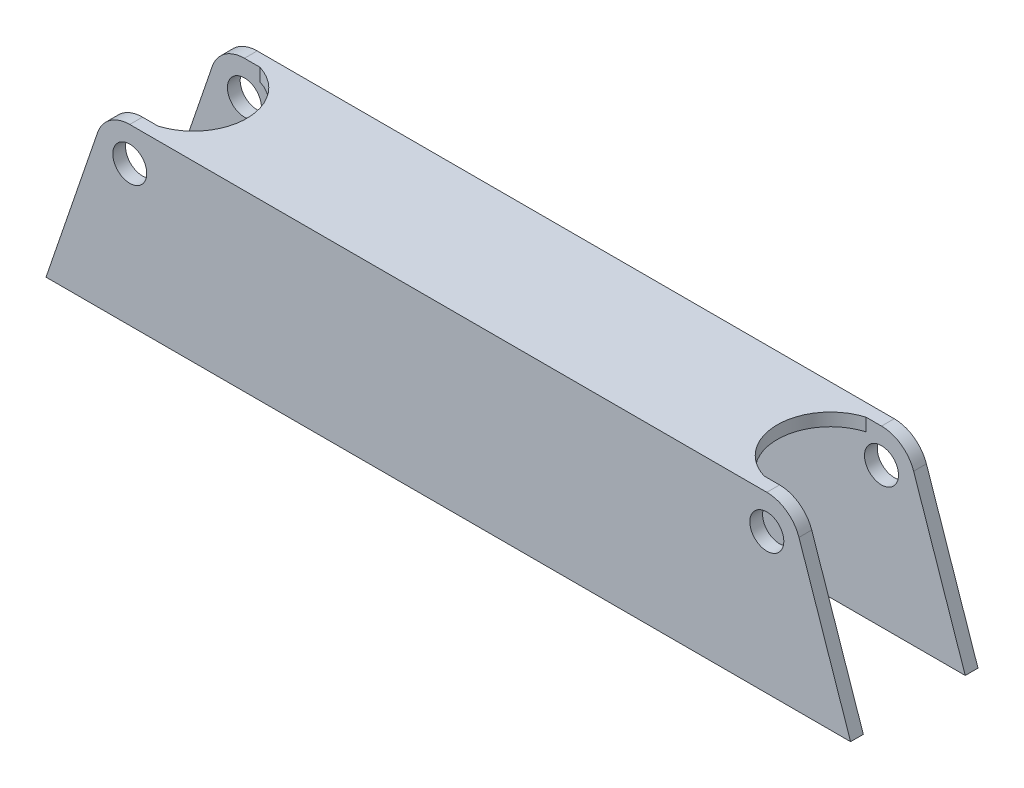
ISO-10303-21;
HEADER;
FILE_DESCRIPTION(('STEP AP214'),'2;1');
FILE_NAME('part.step','',(''),(''),'','','');
FILE_SCHEMA(('AUTOMOTIVE_DESIGN { 1 0 10303 214 1 1 1 1 }'));
ENDSEC;
DATA;
#1=APPLICATION_CONTEXT('core data for automotive mechanical design processes');
#2=APPLICATION_PROTOCOL_DEFINITION('international standard','automotive_design',2000,#1);
#3=PRODUCT_CONTEXT('',#1,'mechanical');
#4=PRODUCT('Part','Part','',(#3));
#5=PRODUCT_RELATED_PRODUCT_CATEGORY('part','',(#4));
#6=PRODUCT_DEFINITION_FORMATION('','',#4);
#7=PRODUCT_DEFINITION_CONTEXT('part definition',#1,'design');
#8=PRODUCT_DEFINITION('design','',#6,#7);
#9=PRODUCT_DEFINITION_SHAPE('','',#8);
#10=(LENGTH_UNIT() NAMED_UNIT(*) SI_UNIT(.MILLI.,.METRE.));
#11=(NAMED_UNIT(*) PLANE_ANGLE_UNIT() SI_UNIT($,.RADIAN.));
#12=(NAMED_UNIT(*) SI_UNIT($,.STERADIAN.) SOLID_ANGLE_UNIT());
#13=UNCERTAINTY_MEASURE_WITH_UNIT(LENGTH_MEASURE(1.E-05),#10,'distance_accuracy_value','');
#14=(GEOMETRIC_REPRESENTATION_CONTEXT(3) GLOBAL_UNCERTAINTY_ASSIGNED_CONTEXT((#13)) GLOBAL_UNIT_ASSIGNED_CONTEXT((#10,
#11,#12)) REPRESENTATION_CONTEXT('',''));
#15=CARTESIAN_POINT('',(0.,0.,0.));
#16=DIRECTION('',(0.,0.,1.));
#17=DIRECTION('',(1.,0.,0.));
#18=AXIS2_PLACEMENT_3D('',#15,#16,#17);
#19=CARTESIAN_POINT('',(0.,348.,0.));
#20=DIRECTION('',(0.,-1.,0.));
#21=DIRECTION('',(0.,0.,-1.));
#22=AXIS2_PLACEMENT_3D('',#19,#20,#21);
#23=PLANE('',#22);
#24=CARTESIAN_POINT('',(-75.,348.,-2115.));
#25=DIRECTION('',(0.,1.,0.));
#26=DIRECTION('',(0.,0.,1.));
#27=AXIS2_PLACEMENT_3D('',#24,#25,#26);
#28=CIRCLE('',#27,12.5419367181576);
#29=CARTESIAN_POINT('',(-71.3530592762864,348.,-2103.));
#30=VERTEX_POINT('',#29);
#31=CARTESIAN_POINT('',(-71.3530592762864,348.,-2127.00000000002));
#32=VERTEX_POINT('',#31);
#33=EDGE_CURVE('E347',#30,#32,#28,.T.);
#34=ORIENTED_EDGE('',*,*,#33,.T.);
#35=DIRECTION('',(-1.,0.,0.));
#36=VECTOR('',#35,1.);
#37=CARTESIAN_POINT('',(0.,348.,-2127.00000000002));
#38=LINE('',#37,#36);
#39=CARTESIAN_POINT('',(71.3530592762901,348.,-2127.00000000002));
#40=VERTEX_POINT('',#39);
#41=EDGE_CURVE('E262',#40,#32,#38,.T.);
#42=ORIENTED_EDGE('',*,*,#41,.F.);
#43=CARTESIAN_POINT('',(75.,348.,-2115.));
#44=DIRECTION('',(0.,-1.,0.));
#45=DIRECTION('',(0.,0.,-1.));
#46=AXIS2_PLACEMENT_3D('',#43,#44,#45);
#47=CIRCLE('',#46,12.5419367181574);
#48=CARTESIAN_POINT('',(71.3530592762901,348.,-2103.));
#49=VERTEX_POINT('',#48);
#50=EDGE_CURVE('E353',#49,#40,#47,.T.);
#51=ORIENTED_EDGE('',*,*,#50,.F.);
#52=DIRECTION('',(-1.,0.,0.));
#53=VECTOR('',#52,1.);
#54=CARTESIAN_POINT('',(0.,348.,-2103.));
#55=LINE('',#54,#53);
#56=EDGE_CURVE('E325',#49,#30,#55,.T.);
#57=ORIENTED_EDGE('',*,*,#56,.T.);
#58=EDGE_LOOP('',(#34,#42,#51,#57));
#59=FACE_BOUND('',#58,.T.);
#60=ADVANCED_FACE('F135',(#59),#23,.T.);
#61=CARTESIAN_POINT('',(-75.,351.,-2115.));
#62=DIRECTION('',(0.,-1.,0.));
#63=DIRECTION('',(0.,0.,-1.));
#64=AXIS2_PLACEMENT_3D('',#61,#62,#63);
#65=CYLINDRICAL_SURFACE('',#64,12.5419367181576);
#66=CARTESIAN_POINT('',(-75.,351.,-2115.));
#67=DIRECTION('',(0.,1.,0.));
#68=DIRECTION('',(0.,0.,1.));
#69=AXIS2_PLACEMENT_3D('',#66,#67,#68);
#70=CIRCLE('',#69,12.5419367181576);
#71=CARTESIAN_POINT('',(-71.3530592762864,351.,-2103.));
#72=VERTEX_POINT('',#71);
#73=CARTESIAN_POINT('',(-71.3530592762864,351.,-2127.00000000002));
#74=VERTEX_POINT('',#73);
#75=EDGE_CURVE('E138',#72,#74,#70,.T.);
#76=ORIENTED_EDGE('',*,*,#75,.T.);
#77=DIRECTION('',(0.,-1.,0.));
#78=VECTOR('',#77,1.);
#79=CARTESIAN_POINT('',(-71.3530592762879,351.,-2127.00000000002));
#80=LINE('',#79,#78);
#81=EDGE_CURVE('E293',#32,#74,#80,.F.);
#82=ORIENTED_EDGE('',*,*,#81,.F.);
#83=ORIENTED_EDGE('',*,*,#33,.F.);
#84=DIRECTION('',(0.,-1.,0.));
#85=VECTOR('',#84,1.);
#86=CARTESIAN_POINT('',(-71.3530592762879,351.,-2103.));
#87=LINE('',#86,#85);
#88=EDGE_CURVE('E159',#30,#72,#87,.F.);
#89=ORIENTED_EDGE('',*,*,#88,.T.);
#90=EDGE_LOOP('',(#76,#82,#83,#89));
#91=FACE_BOUND('',#90,.T.);
#92=ADVANCED_FACE('F370',(#91),#65,.F.);
#93=CARTESIAN_POINT('',(75.,351.,-2115.));
#94=DIRECTION('',(0.,-1.,0.));
#95=DIRECTION('',(0.,0.,-1.));
#96=AXIS2_PLACEMENT_3D('',#93,#94,#95);
#97=CYLINDRICAL_SURFACE('',#96,12.5419367181574);
#98=DIRECTION('',(0.,-1.,0.));
#99=VECTOR('',#98,1.);
#100=CARTESIAN_POINT('',(71.3530592762901,351.,-2127.00000000002));
#101=LINE('',#100,#99);
#102=CARTESIAN_POINT('',(71.3530592762886,351.,-2127.00000000002));
#103=VERTEX_POINT('',#102);
#104=EDGE_CURVE('E295',#40,#103,#101,.F.);
#105=ORIENTED_EDGE('',*,*,#104,.T.);
#106=CARTESIAN_POINT('',(75.,351.,-2115.));
#107=DIRECTION('',(0.,-1.,0.));
#108=DIRECTION('',(0.,0.,-1.));
#109=AXIS2_PLACEMENT_3D('',#106,#107,#108);
#110=CIRCLE('',#109,12.5419367181574);
#111=CARTESIAN_POINT('',(71.3530592762886,351.,-2103.));
#112=VERTEX_POINT('',#111);
#113=EDGE_CURVE('E144',#112,#103,#110,.T.);
#114=ORIENTED_EDGE('',*,*,#113,.F.);
#115=DIRECTION('',(0.,-1.,0.));
#116=VECTOR('',#115,1.);
#117=CARTESIAN_POINT('',(71.3530592762901,351.,-2103.));
#118=LINE('',#117,#116);
#119=EDGE_CURVE('E12',#49,#112,#118,.F.);
#120=ORIENTED_EDGE('',*,*,#119,.F.);
#121=ORIENTED_EDGE('',*,*,#50,.T.);
#122=EDGE_LOOP('',(#105,#114,#120,#121));
#123=FACE_BOUND('',#122,.T.);
#124=ADVANCED_FACE('F369',(#123),#97,.F.);
#125=CARTESIAN_POINT('',(0.,351.,0.));
#126=DIRECTION('',(0.,-1.,0.));
#127=DIRECTION('',(0.,0.,-1.));
#128=AXIS2_PLACEMENT_3D('',#125,#126,#127);
#129=PLANE('',#128);
#130=DIRECTION('',(0.,0.,1.));
#131=VECTOR('',#130,1.);
#132=CARTESIAN_POINT('',(-75.,351.,-2103.));
#133=LINE('',#132,#131);
#134=CARTESIAN_POINT('',(-75.,351.,-2103.));
#135=VERTEX_POINT('',#134);
#136=CARTESIAN_POINT('',(-75.,351.,-2100.));
#137=VERTEX_POINT('',#136);
#138=EDGE_CURVE('E530',#135,#137,#133,.T.);
#139=ORIENTED_EDGE('',*,*,#138,.T.);
#140=DIRECTION('',(-1.,0.,0.));
#141=VECTOR('',#140,1.);
#142=CARTESIAN_POINT('',(75.,351.,-2100.));
#143=LINE('',#142,#141);
#144=CARTESIAN_POINT('',(75.,351.,-2100.));
#145=VERTEX_POINT('',#144);
#146=EDGE_CURVE('E332',#145,#137,#143,.T.);
#147=ORIENTED_EDGE('',*,*,#146,.F.);
#148=DIRECTION('',(0.,0.,1.));
#149=VECTOR('',#148,1.);
#150=CARTESIAN_POINT('',(75.,351.,-2103.));
#151=LINE('',#150,#149);
#152=CARTESIAN_POINT('',(75.,351.,-2103.));
#153=VERTEX_POINT('',#152);
#154=EDGE_CURVE('E329',#153,#145,#151,.T.);
#155=ORIENTED_EDGE('',*,*,#154,.F.);
#156=DIRECTION('',(-1.,0.,0.));
#157=VECTOR('',#156,1.);
#158=CARTESIAN_POINT('',(75.,351.,-2103.));
#159=LINE('',#158,#157);
#160=EDGE_CURVE('E152',#153,#112,#159,.T.);
#161=ORIENTED_EDGE('',*,*,#160,.T.);
#162=ORIENTED_EDGE('',*,*,#113,.T.);
#163=DIRECTION('',(-1.,0.,0.));
#164=VECTOR('',#163,1.);
#165=CARTESIAN_POINT('',(75.,351.,-2127.00000000002));
#166=LINE('',#165,#164);
#167=CARTESIAN_POINT('',(75.,351.,-2127.00000000002));
#168=VERTEX_POINT('',#167);
#169=EDGE_CURVE('E256',#168,#103,#166,.T.);
#170=ORIENTED_EDGE('',*,*,#169,.F.);
#171=DIRECTION('',(0.,0.,-1.));
#172=VECTOR('',#171,1.);
#173=CARTESIAN_POINT('',(75.,351.,-2127.00000000002));
#174=LINE('',#173,#172);
#175=CARTESIAN_POINT('',(75.,351.,-2130.00000000002));
#176=VERTEX_POINT('',#175);
#177=EDGE_CURVE('E266',#168,#176,#174,.T.);
#178=ORIENTED_EDGE('',*,*,#177,.T.);
#179=DIRECTION('',(-1.,0.,0.));
#180=VECTOR('',#179,1.);
#181=CARTESIAN_POINT('',(75.,351.,-2130.00000000002));
#182=LINE('',#181,#180);
#183=CARTESIAN_POINT('',(-75.,351.,-2130.00000000002));
#184=VERTEX_POINT('',#183);
#185=EDGE_CURVE('E272',#176,#184,#182,.T.);
#186=ORIENTED_EDGE('',*,*,#185,.T.);
#187=DIRECTION('',(0.,0.,-1.));
#188=VECTOR('',#187,1.);
#189=CARTESIAN_POINT('',(-75.,351.,-2127.00000000002));
#190=LINE('',#189,#188);
#191=CARTESIAN_POINT('',(-75.,351.,-2127.00000000002));
#192=VERTEX_POINT('',#191);
#193=EDGE_CURVE('E373',#192,#184,#190,.T.);
#194=ORIENTED_EDGE('',*,*,#193,.F.);
#195=EDGE_CURVE('E271',#74,#192,#166,.T.);
#196=ORIENTED_EDGE('',*,*,#195,.F.);
#197=ORIENTED_EDGE('',*,*,#75,.F.);
#198=EDGE_CURVE('E331',#72,#135,#159,.T.);
#199=ORIENTED_EDGE('',*,*,#198,.T.);
#200=EDGE_LOOP('',(#139,#147,#155,#161,#162,#170,#178,#186,#194,#196,#197,#199));
#201=FACE_BOUND('',#200,.T.);
#202=ADVANCED_FACE('F274',(#201),#129,.F.);
#203=CARTESIAN_POINT('',(0.,4.93666644421465E-11,-2100.00000000001));
#204=DIRECTION('',(0.,0.,1.));
#205=DIRECTION('',(0.,-1.,0.));
#206=AXIS2_PLACEMENT_3D('',#203,#204,#205);
#207=PLANE('',#206);
#208=CARTESIAN_POINT('',(75.,343.,-2100.));
#209=DIRECTION('',(0.,0.,1.));
#210=DIRECTION('',(1.,0.,0.));
#211=AXIS2_PLACEMENT_3D('',#208,#209,#210);
#212=CIRCLE('',#211,4.00000000000001);
#213=CARTESIAN_POINT('',(79.,343.,-2100.));
#214=VERTEX_POINT('',#213);
#215=EDGE_CURVE('E300',#214,#214,#212,.T.);
#216=ORIENTED_EDGE('',*,*,#215,.F.);
#217=EDGE_LOOP('',(#216));
#218=FACE_BOUND('',#217,.T.);
#219=CARTESIAN_POINT('',(-75.,343.,-2100.));
#220=DIRECTION('',(0.,0.,1.));
#221=DIRECTION('',(1.,0.,0.));
#222=AXIS2_PLACEMENT_3D('',#219,#220,#221);
#223=CIRCLE('',#222,4.00000000000001);
#224=CARTESIAN_POINT('',(-71.,343.,-2100.));
#225=VERTEX_POINT('',#224);
#226=EDGE_CURVE('E306',#225,#225,#223,.T.);
#227=ORIENTED_EDGE('',*,*,#226,.F.);
#228=EDGE_LOOP('',(#227));
#229=FACE_BOUND('',#228,.T.);
#230=DIRECTION('',(-0.323185532868873,0.94633562299232,0.));
#231=VECTOR('',#230,1.);
#232=CARTESIAN_POINT('',(82.5706849839386,345.585484262951,-2100.));
#233=LINE('',#232,#231);
#234=CARTESIAN_POINT('',(94.7235760032507,310.000000000001,-2100.));
#235=VERTEX_POINT('',#234);
#236=CARTESIAN_POINT('',(82.5706849839386,345.585484262951,-2100.));
#237=VERTEX_POINT('',#236);
#238=EDGE_CURVE('E309',#235,#237,#233,.T.);
#239=ORIENTED_EDGE('',*,*,#238,.T.);
#240=CARTESIAN_POINT('',(75.,343.,-2100.));
#241=DIRECTION('',(0.,0.,1.));
#242=DIRECTION('',(1.,0.,0.));
#243=AXIS2_PLACEMENT_3D('',#240,#241,#242);
#244=CIRCLE('',#243,8.00000000000001);
#245=EDGE_CURVE('E326',#237,#145,#244,.T.);
#246=ORIENTED_EDGE('',*,*,#245,.T.);
#247=ORIENTED_EDGE('',*,*,#146,.T.);
#248=CARTESIAN_POINT('',(-75.,343.,-2100.));
#249=DIRECTION('',(0.,0.,1.));
#250=DIRECTION('',(1.,0.,0.));
#251=AXIS2_PLACEMENT_3D('',#248,#249,#250);
#252=CIRCLE('',#251,8.00000000000001);
#253=CARTESIAN_POINT('',(-82.5706849839386,345.585484262951,-2100.));
#254=VERTEX_POINT('',#253);
#255=EDGE_CURVE('E532',#137,#254,#252,.T.);
#256=ORIENTED_EDGE('',*,*,#255,.T.);
#257=DIRECTION('',(-0.323185532868873,-0.94633562299232,0.));
#258=VECTOR('',#257,1.);
#259=CARTESIAN_POINT('',(-82.5706849839386,345.585484262951,-2100.));
#260=LINE('',#259,#258);
#261=CARTESIAN_POINT('',(-94.7235760032507,310.000000000001,-2100.));
#262=VERTEX_POINT('',#261);
#263=EDGE_CURVE('E546',#254,#262,#260,.T.);
#264=ORIENTED_EDGE('',*,*,#263,.T.);
#265=DIRECTION('',(1.,0.,0.));
#266=VECTOR('',#265,1.);
#267=CARTESIAN_POINT('',(94.7235760032507,310.000000000001,-2100.));
#268=LINE('',#267,#266);
#269=EDGE_CURVE('E313',#262,#235,#268,.T.);
#270=ORIENTED_EDGE('',*,*,#269,.T.);
#271=EDGE_LOOP('',(#239,#246,#247,#256,#264,#270));
#272=FACE_BOUND('',#271,.T.);
#273=ADVANCED_FACE('F471',(#218,#229,#272),#207,.T.);
#274=CARTESIAN_POINT('',(0.,4.93666644421465E-11,-2103.00000000001));
#275=DIRECTION('',(0.,0.,1.));
#276=DIRECTION('',(0.,-1.,0.));
#277=AXIS2_PLACEMENT_3D('',#274,#275,#276);
#278=PLANE('',#277);
#279=ORIENTED_EDGE('',*,*,#88,.F.);
#280=ORIENTED_EDGE('',*,*,#56,.F.);
#281=ORIENTED_EDGE('',*,*,#119,.T.);
#282=ORIENTED_EDGE('',*,*,#160,.F.);
#283=CARTESIAN_POINT('',(75.,343.,-2103.));
#284=DIRECTION('',(0.,0.,1.));
#285=DIRECTION('',(1.,0.,0.));
#286=AXIS2_PLACEMENT_3D('',#283,#284,#285);
#287=CIRCLE('',#286,8.00000000000001);
#288=CARTESIAN_POINT('',(82.5706849839386,345.585484262951,-2103.));
#289=VERTEX_POINT('',#288);
#290=EDGE_CURVE('E322',#289,#153,#287,.T.);
#291=ORIENTED_EDGE('',*,*,#290,.F.);
#292=DIRECTION('',(-0.323185532868873,0.94633562299232,0.));
#293=VECTOR('',#292,1.);
#294=CARTESIAN_POINT('',(82.5706849839386,345.585484262951,-2103.));
#295=LINE('',#294,#293);
#296=CARTESIAN_POINT('',(94.7235760032507,310.000000000001,-2103.));
#297=VERTEX_POINT('',#296);
#298=EDGE_CURVE('E314',#297,#289,#295,.T.);
#299=ORIENTED_EDGE('',*,*,#298,.F.);
#300=DIRECTION('',(1.,0.,0.));
#301=VECTOR('',#300,1.);
#302=CARTESIAN_POINT('',(94.7235760032507,310.000000000001,-2103.));
#303=LINE('',#302,#301);
#304=CARTESIAN_POINT('',(-94.7235760032507,310.000000000001,-2103.));
#305=VERTEX_POINT('',#304);
#306=EDGE_CURVE('E554',#305,#297,#303,.T.);
#307=ORIENTED_EDGE('',*,*,#306,.F.);
#308=DIRECTION('',(-0.323185532868873,-0.94633562299232,0.));
#309=VECTOR('',#308,1.);
#310=CARTESIAN_POINT('',(-82.5706849839386,345.585484262951,-2103.));
#311=LINE('',#310,#309);
#312=CARTESIAN_POINT('',(-82.5706849839386,345.585484262951,-2103.));
#313=VERTEX_POINT('',#312);
#314=EDGE_CURVE('E540',#313,#305,#311,.T.);
#315=ORIENTED_EDGE('',*,*,#314,.F.);
#316=CARTESIAN_POINT('',(-75.,343.,-2103.));
#317=DIRECTION('',(0.,0.,1.));
#318=DIRECTION('',(1.,0.,0.));
#319=AXIS2_PLACEMENT_3D('',#316,#317,#318);
#320=CIRCLE('',#319,8.00000000000001);
#321=EDGE_CURVE('E527',#135,#313,#320,.T.);
#322=ORIENTED_EDGE('',*,*,#321,.F.);
#323=ORIENTED_EDGE('',*,*,#198,.F.);
#324=EDGE_LOOP('',(#279,#280,#281,#282,#291,#299,#307,#315,#322,#323));
#325=FACE_BOUND('',#324,.T.);
#326=CARTESIAN_POINT('',(75.,343.,-2103.));
#327=DIRECTION('',(0.,0.,1.));
#328=DIRECTION('',(1.,0.,0.));
#329=AXIS2_PLACEMENT_3D('',#326,#327,#328);
#330=CIRCLE('',#329,4.00000000000001);
#331=CARTESIAN_POINT('',(79.,343.,-2103.));
#332=VERTEX_POINT('',#331);
#333=EDGE_CURVE('E297',#332,#332,#330,.T.);
#334=ORIENTED_EDGE('',*,*,#333,.T.);
#335=EDGE_LOOP('',(#334));
#336=FACE_BOUND('',#335,.T.);
#337=CARTESIAN_POINT('',(-75.,343.,-2103.));
#338=DIRECTION('',(0.,0.,1.));
#339=DIRECTION('',(1.,0.,0.));
#340=AXIS2_PLACEMENT_3D('',#337,#338,#339);
#341=CIRCLE('',#340,4.00000000000001);
#342=CARTESIAN_POINT('',(-71.,343.,-2103.));
#343=VERTEX_POINT('',#342);
#344=EDGE_CURVE('E303',#343,#343,#341,.T.);
#345=ORIENTED_EDGE('',*,*,#344,.T.);
#346=EDGE_LOOP('',(#345));
#347=FACE_BOUND('',#346,.T.);
#348=ADVANCED_FACE('F478',(#325,#336,#347),#278,.F.);
#349=CARTESIAN_POINT('',(82.5706849839386,345.585484262951,-2103.));
#350=DIRECTION('',(0.94633562299232,0.323185532868873,0.));
#351=DIRECTION('',(-0.323185532868873,0.94633562299232,0.));
#352=AXIS2_PLACEMENT_3D('',#349,#350,#351);
#353=PLANE('',#352);
#354=ORIENTED_EDGE('',*,*,#238,.F.);
#355=DIRECTION('',(0.,0.,1.));
#356=VECTOR('',#355,1.);
#357=CARTESIAN_POINT('',(94.7235760032507,310.000000000001,-2103.));
#358=LINE('',#357,#356);
#359=EDGE_CURVE('E319',#297,#235,#358,.T.);
#360=ORIENTED_EDGE('',*,*,#359,.F.);
#361=ORIENTED_EDGE('',*,*,#298,.T.);
#362=DIRECTION('',(0.,0.,1.));
#363=VECTOR('',#362,1.);
#364=CARTESIAN_POINT('',(82.5706849839386,345.585484262951,-2103.));
#365=LINE('',#364,#363);
#366=EDGE_CURVE('E310',#289,#237,#365,.T.);
#367=ORIENTED_EDGE('',*,*,#366,.T.);
#368=EDGE_LOOP('',(#354,#360,#361,#367));
#369=FACE_BOUND('',#368,.T.);
#370=ADVANCED_FACE('F498',(#369),#353,.T.);
#371=CARTESIAN_POINT('',(94.7235760032507,310.000000000001,-2103.));
#372=DIRECTION('',(0.,-1.,0.));
#373=DIRECTION('',(0.,0.,-1.));
#374=AXIS2_PLACEMENT_3D('',#371,#372,#373);
#375=PLANE('',#374);
#376=ORIENTED_EDGE('',*,*,#269,.F.);
#377=DIRECTION('',(0.,0.,1.));
#378=VECTOR('',#377,1.);
#379=CARTESIAN_POINT('',(-94.7235760032507,310.000000000001,-2103.));
#380=LINE('',#379,#378);
#381=EDGE_CURVE('E557',#305,#262,#380,.T.);
#382=ORIENTED_EDGE('',*,*,#381,.F.);
#383=ORIENTED_EDGE('',*,*,#306,.T.);
#384=ORIENTED_EDGE('',*,*,#359,.T.);
#385=EDGE_LOOP('',(#376,#382,#383,#384));
#386=FACE_BOUND('',#385,.T.);
#387=ADVANCED_FACE('F502',(#386),#375,.T.);
#388=CARTESIAN_POINT('',(-82.5706849839386,345.585484262951,-2103.));
#389=DIRECTION('',(-0.94633562299232,0.323185532868873,0.));
#390=DIRECTION('',(-0.323185532868873,-0.94633562299232,0.));
#391=AXIS2_PLACEMENT_3D('',#388,#389,#390);
#392=PLANE('',#391);
#393=ORIENTED_EDGE('',*,*,#263,.F.);
#394=DIRECTION('',(0.,0.,1.));
#395=VECTOR('',#394,1.);
#396=CARTESIAN_POINT('',(-82.5706849839386,345.585484262951,-2103.));
#397=LINE('',#396,#395);
#398=EDGE_CURVE('E543',#313,#254,#397,.T.);
#399=ORIENTED_EDGE('',*,*,#398,.F.);
#400=ORIENTED_EDGE('',*,*,#314,.T.);
#401=ORIENTED_EDGE('',*,*,#381,.T.);
#402=EDGE_LOOP('',(#393,#399,#400,#401));
#403=FACE_BOUND('',#402,.T.);
#404=ADVANCED_FACE('F492',(#403),#392,.T.);
#405=CARTESIAN_POINT('',(-75.,343.,-2103.));
#406=DIRECTION('',(0.,0.,1.));
#407=DIRECTION('',(1.,0.,0.));
#408=AXIS2_PLACEMENT_3D('',#405,#406,#407);
#409=CYLINDRICAL_SURFACE('',#408,8.00000000000001);
#410=ORIENTED_EDGE('',*,*,#255,.F.);
#411=ORIENTED_EDGE('',*,*,#138,.F.);
#412=ORIENTED_EDGE('',*,*,#321,.T.);
#413=ORIENTED_EDGE('',*,*,#398,.T.);
#414=EDGE_LOOP('',(#410,#411,#412,#413));
#415=FACE_BOUND('',#414,.T.);
#416=ADVANCED_FACE('F482',(#415),#409,.T.);
#417=CARTESIAN_POINT('',(75.,343.,-2103.));
#418=DIRECTION('',(0.,0.,1.));
#419=DIRECTION('',(1.,0.,0.));
#420=AXIS2_PLACEMENT_3D('',#417,#418,#419);
#421=CYLINDRICAL_SURFACE('',#420,8.00000000000001);
#422=ORIENTED_EDGE('',*,*,#245,.F.);
#423=ORIENTED_EDGE('',*,*,#366,.F.);
#424=ORIENTED_EDGE('',*,*,#290,.T.);
#425=ORIENTED_EDGE('',*,*,#154,.T.);
#426=EDGE_LOOP('',(#422,#423,#424,#425));
#427=FACE_BOUND('',#426,.T.);
#428=ADVANCED_FACE('F474',(#427),#421,.T.);
#429=CARTESIAN_POINT('',(-75.,343.,-2103.));
#430=DIRECTION('',(0.,0.,1.));
#431=DIRECTION('',(1.,0.,0.));
#432=AXIS2_PLACEMENT_3D('',#429,#430,#431);
#433=CYLINDRICAL_SURFACE('',#432,4.00000000000001);
#434=ORIENTED_EDGE('',*,*,#344,.F.);
#435=EDGE_LOOP('',(#434));
#436=FACE_BOUND('',#435,.T.);
#437=ORIENTED_EDGE('',*,*,#226,.T.);
#438=EDGE_LOOP('',(#437));
#439=FACE_BOUND('',#438,.T.);
#440=ADVANCED_FACE('F480',(#436,#439),#433,.F.);
#441=CARTESIAN_POINT('',(75.,343.,-2103.));
#442=DIRECTION('',(0.,0.,1.));
#443=DIRECTION('',(1.,0.,0.));
#444=AXIS2_PLACEMENT_3D('',#441,#442,#443);
#445=CYLINDRICAL_SURFACE('',#444,4.00000000000001);
#446=ORIENTED_EDGE('',*,*,#333,.F.);
#447=EDGE_LOOP('',(#446));
#448=FACE_BOUND('',#447,.T.);
#449=ORIENTED_EDGE('',*,*,#215,.T.);
#450=EDGE_LOOP('',(#449));
#451=FACE_BOUND('',#450,.T.);
#452=ADVANCED_FACE('F489',(#448,#451),#445,.F.);
#453=CARTESIAN_POINT('',(0.,4.93666644421465E-11,-2130.00000000002));
#454=DIRECTION('',(0.,0.,-1.));
#455=DIRECTION('',(0.,-1.,0.));
#456=AXIS2_PLACEMENT_3D('',#453,#454,#455);
#457=PLANE('',#456);
#458=CARTESIAN_POINT('',(75.,343.,-2130.00000000002));
#459=DIRECTION('',(0.,0.,1.));
#460=DIRECTION('',(1.,0.,0.));
#461=AXIS2_PLACEMENT_3D('',#458,#459,#460);
#462=CIRCLE('',#461,4.00000000000001);
#463=CARTESIAN_POINT('',(79.,343.,-2130.00000000002));
#464=VERTEX_POINT('',#463);
#465=EDGE_CURVE('E430',#464,#464,#462,.T.);
#466=ORIENTED_EDGE('',*,*,#465,.T.);
#467=EDGE_LOOP('',(#466));
#468=FACE_BOUND('',#467,.T.);
#469=CARTESIAN_POINT('',(-75.,343.,-2130.00000000002));
#470=DIRECTION('',(0.,0.,1.));
#471=DIRECTION('',(1.,0.,0.));
#472=AXIS2_PLACEMENT_3D('',#469,#470,#471);
#473=CIRCLE('',#472,4.00000000000001);
#474=CARTESIAN_POINT('',(-71.,343.,-2130.00000000002));
#475=VERTEX_POINT('',#474);
#476=EDGE_CURVE('E422',#475,#475,#473,.T.);
#477=ORIENTED_EDGE('',*,*,#476,.T.);
#478=EDGE_LOOP('',(#477));
#479=FACE_BOUND('',#478,.T.);
#480=DIRECTION('',(-0.323185532868873,0.94633562299232,0.));
#481=VECTOR('',#480,1.);
#482=CARTESIAN_POINT('',(82.5706849839386,345.585484262951,-2130.00000000002));
#483=LINE('',#482,#481);
#484=CARTESIAN_POINT('',(94.7235760032507,310.000000000001,-2130.00000000002));
#485=VERTEX_POINT('',#484);
#486=CARTESIAN_POINT('',(82.5706849839386,345.585484262951,-2130.00000000002));
#487=VERTEX_POINT('',#486);
#488=EDGE_CURVE('E285',#485,#487,#483,.T.);
#489=ORIENTED_EDGE('',*,*,#488,.F.);
#490=DIRECTION('',(1.,0.,0.));
#491=VECTOR('',#490,1.);
#492=CARTESIAN_POINT('',(94.7235760032507,310.000000000001,-2130.00000000002));
#493=LINE('',#492,#491);
#494=CARTESIAN_POINT('',(-94.7235760032507,310.000000000001,-2130.00000000002));
#495=VERTEX_POINT('',#494);
#496=EDGE_CURVE('E408',#495,#485,#493,.T.);
#497=ORIENTED_EDGE('',*,*,#496,.F.);
#498=DIRECTION('',(-0.323185532868873,-0.94633562299232,0.));
#499=VECTOR('',#498,1.);
#500=CARTESIAN_POINT('',(-82.5706849839386,345.585484262951,-2130.00000000002));
#501=LINE('',#500,#499);
#502=CARTESIAN_POINT('',(-82.5706849839386,345.585484262951,-2130.00000000002));
#503=VERTEX_POINT('',#502);
#504=EDGE_CURVE('E395',#503,#495,#501,.T.);
#505=ORIENTED_EDGE('',*,*,#504,.F.);
#506=CARTESIAN_POINT('',(-75.,343.,-2130.00000000002));
#507=DIRECTION('',(0.,0.,1.));
#508=DIRECTION('',(1.,0.,0.));
#509=AXIS2_PLACEMENT_3D('',#506,#507,#508);
#510=CIRCLE('',#509,8.00000000000001);
#511=EDGE_CURVE('E382',#184,#503,#510,.T.);
#512=ORIENTED_EDGE('',*,*,#511,.F.);
#513=ORIENTED_EDGE('',*,*,#185,.F.);
#514=CARTESIAN_POINT('',(75.,343.,-2130.00000000002));
#515=DIRECTION('',(0.,0.,1.));
#516=DIRECTION('',(1.,0.,0.));
#517=AXIS2_PLACEMENT_3D('',#514,#515,#516);
#518=CIRCLE('',#517,8.00000000000001);
#519=EDGE_CURVE('E263',#487,#176,#518,.T.);
#520=ORIENTED_EDGE('',*,*,#519,.F.);
#521=EDGE_LOOP('',(#489,#497,#505,#512,#513,#520));
#522=FACE_BOUND('',#521,.T.);
#523=ADVANCED_FACE('F441',(#468,#479,#522),#457,.T.);
#524=CARTESIAN_POINT('',(0.,4.93666644421465E-11,-2127.00000000002));
#525=DIRECTION('',(0.,0.,-1.));
#526=DIRECTION('',(0.,-1.,0.));
#527=AXIS2_PLACEMENT_3D('',#524,#525,#526);
#528=PLANE('',#527);
#529=ORIENTED_EDGE('',*,*,#81,.T.);
#530=ORIENTED_EDGE('',*,*,#195,.T.);
#531=CARTESIAN_POINT('',(-75.,343.,-2127.00000000002));
#532=DIRECTION('',(0.,0.,1.));
#533=DIRECTION('',(1.,0.,0.));
#534=AXIS2_PLACEMENT_3D('',#531,#532,#533);
#535=CIRCLE('',#534,8.00000000000001);
#536=CARTESIAN_POINT('',(-82.5706849839386,345.585484262951,-2127.00000000002));
#537=VERTEX_POINT('',#536);
#538=EDGE_CURVE('E376',#192,#537,#535,.T.);
#539=ORIENTED_EDGE('',*,*,#538,.T.);
#540=DIRECTION('',(-0.323185532868873,-0.94633562299232,0.));
#541=VECTOR('',#540,1.);
#542=CARTESIAN_POINT('',(-82.5706849839386,345.585484262951,-2127.00000000002));
#543=LINE('',#542,#541);
#544=CARTESIAN_POINT('',(-94.7235760032507,310.000000000001,-2127.00000000002));
#545=VERTEX_POINT('',#544);
#546=EDGE_CURVE('E378',#537,#545,#543,.T.);
#547=ORIENTED_EDGE('',*,*,#546,.T.);
#548=DIRECTION('',(1.,0.,0.));
#549=VECTOR('',#548,1.);
#550=CARTESIAN_POINT('',(94.7235760032507,310.000000000001,-2127.00000000002));
#551=LINE('',#550,#549);
#552=CARTESIAN_POINT('',(94.7235760032507,310.000000000001,-2127.00000000002));
#553=VERTEX_POINT('',#552);
#554=EDGE_CURVE('E403',#545,#553,#551,.T.);
#555=ORIENTED_EDGE('',*,*,#554,.T.);
#556=DIRECTION('',(-0.323185532868873,0.94633562299232,0.));
#557=VECTOR('',#556,1.);
#558=CARTESIAN_POINT('',(82.5706849839386,345.585484262951,-2127.00000000002));
#559=LINE('',#558,#557);
#560=CARTESIAN_POINT('',(82.5706849839386,345.585484262951,-2127.00000000002));
#561=VERTEX_POINT('',#560);
#562=EDGE_CURVE('E260',#553,#561,#559,.T.);
#563=ORIENTED_EDGE('',*,*,#562,.T.);
#564=CARTESIAN_POINT('',(75.,343.,-2127.00000000002));
#565=DIRECTION('',(0.,0.,1.));
#566=DIRECTION('',(1.,0.,0.));
#567=AXIS2_PLACEMENT_3D('',#564,#565,#566);
#568=CIRCLE('',#567,8.00000000000001);
#569=EDGE_CURVE('E250',#561,#168,#568,.T.);
#570=ORIENTED_EDGE('',*,*,#569,.T.);
#571=ORIENTED_EDGE('',*,*,#169,.T.);
#572=ORIENTED_EDGE('',*,*,#104,.F.);
#573=ORIENTED_EDGE('',*,*,#41,.T.);
#574=EDGE_LOOP('',(#529,#530,#539,#547,#555,#563,#570,#571,#572,#573));
#575=FACE_BOUND('',#574,.T.);
#576=CARTESIAN_POINT('',(75.,343.,-2127.00000000002));
#577=DIRECTION('',(0.,0.,1.));
#578=DIRECTION('',(1.,0.,0.));
#579=AXIS2_PLACEMENT_3D('',#576,#577,#578);
#580=CIRCLE('',#579,4.00000000000001);
#581=CARTESIAN_POINT('',(79.,343.,-2127.00000000002));
#582=VERTEX_POINT('',#581);
#583=EDGE_CURVE('E729',#582,#582,#580,.T.);
#584=ORIENTED_EDGE('',*,*,#583,.F.);
#585=EDGE_LOOP('',(#584));
#586=FACE_BOUND('',#585,.T.);
#587=CARTESIAN_POINT('',(-75.,343.,-2127.00000000002));
#588=DIRECTION('',(0.,0.,1.));
#589=DIRECTION('',(1.,0.,0.));
#590=AXIS2_PLACEMENT_3D('',#587,#588,#589);
#591=CIRCLE('',#590,4.00000000000001);
#592=CARTESIAN_POINT('',(-71.,343.,-2127.00000000002));
#593=VERTEX_POINT('',#592);
#594=EDGE_CURVE('E425',#593,#593,#591,.T.);
#595=ORIENTED_EDGE('',*,*,#594,.F.);
#596=EDGE_LOOP('',(#595));
#597=FACE_BOUND('',#596,.T.);
#598=ADVANCED_FACE('F253',(#575,#586,#597),#528,.F.);
#599=CARTESIAN_POINT('',(82.5706849839386,345.585484262951,-2127.00000000002));
#600=DIRECTION('',(0.94633562299232,0.323185532868873,0.));
#601=DIRECTION('',(-0.323185532868873,0.94633562299232,0.));
#602=AXIS2_PLACEMENT_3D('',#599,#600,#601);
#603=PLANE('',#602);
#604=ORIENTED_EDGE('',*,*,#488,.T.);
#605=DIRECTION('',(0.,0.,-1.));
#606=VECTOR('',#605,1.);
#607=CARTESIAN_POINT('',(82.5706849839386,345.585484262951,-2127.00000000002));
#608=LINE('',#607,#606);
#609=EDGE_CURVE('E416',#561,#487,#608,.T.);
#610=ORIENTED_EDGE('',*,*,#609,.F.);
#611=ORIENTED_EDGE('',*,*,#562,.F.);
#612=DIRECTION('',(0.,0.,-1.));
#613=VECTOR('',#612,1.);
#614=CARTESIAN_POINT('',(94.7235760032507,310.000000000001,-2127.00000000002));
#615=LINE('',#614,#613);
#616=EDGE_CURVE('E418',#553,#485,#615,.T.);
#617=ORIENTED_EDGE('',*,*,#616,.T.);
#618=EDGE_LOOP('',(#604,#610,#611,#617));
#619=FACE_BOUND('',#618,.T.);
#620=ADVANCED_FACE('F451',(#619),#603,.T.);
#621=CARTESIAN_POINT('',(94.7235760032507,310.000000000001,-2127.00000000002));
#622=DIRECTION('',(0.,-1.,0.));
#623=DIRECTION('',(0.,0.,1.));
#624=AXIS2_PLACEMENT_3D('',#621,#622,#623);
#625=PLANE('',#624);
#626=ORIENTED_EDGE('',*,*,#496,.T.);
#627=ORIENTED_EDGE('',*,*,#616,.F.);
#628=ORIENTED_EDGE('',*,*,#554,.F.);
#629=DIRECTION('',(0.,0.,-1.));
#630=VECTOR('',#629,1.);
#631=CARTESIAN_POINT('',(-94.7235760032507,310.000000000001,-2127.00000000002));
#632=LINE('',#631,#630);
#633=EDGE_CURVE('E406',#545,#495,#632,.T.);
#634=ORIENTED_EDGE('',*,*,#633,.T.);
#635=EDGE_LOOP('',(#626,#627,#628,#634));
#636=FACE_BOUND('',#635,.T.);
#637=ADVANCED_FACE('F450',(#636),#625,.T.);
#638=CARTESIAN_POINT('',(-82.5706849839386,345.585484262951,-2127.00000000002));
#639=DIRECTION('',(-0.94633562299232,0.323185532868873,0.));
#640=DIRECTION('',(-0.323185532868873,-0.94633562299232,0.));
#641=AXIS2_PLACEMENT_3D('',#638,#639,#640);
#642=PLANE('',#641);
#643=ORIENTED_EDGE('',*,*,#504,.T.);
#644=ORIENTED_EDGE('',*,*,#633,.F.);
#645=ORIENTED_EDGE('',*,*,#546,.F.);
#646=DIRECTION('',(0.,0.,-1.));
#647=VECTOR('',#646,1.);
#648=CARTESIAN_POINT('',(-82.5706849839386,345.585484262951,-2127.00000000002));
#649=LINE('',#648,#647);
#650=EDGE_CURVE('E393',#537,#503,#649,.T.);
#651=ORIENTED_EDGE('',*,*,#650,.T.);
#652=EDGE_LOOP('',(#643,#644,#645,#651));
#653=FACE_BOUND('',#652,.T.);
#654=ADVANCED_FACE('F447',(#653),#642,.T.);
#655=CARTESIAN_POINT('',(-75.,343.,-2127.00000000002));
#656=DIRECTION('',(0.,0.,-1.));
#657=DIRECTION('',(1.,0.,0.));
#658=AXIS2_PLACEMENT_3D('',#655,#656,#657);
#659=CYLINDRICAL_SURFACE('',#658,8.00000000000001);
#660=ORIENTED_EDGE('',*,*,#511,.T.);
#661=ORIENTED_EDGE('',*,*,#650,.F.);
#662=ORIENTED_EDGE('',*,*,#538,.F.);
#663=ORIENTED_EDGE('',*,*,#193,.T.);
#664=EDGE_LOOP('',(#660,#661,#662,#663));
#665=FACE_BOUND('',#664,.T.);
#666=ADVANCED_FACE('F445',(#665),#659,.T.);
#667=CARTESIAN_POINT('',(75.,343.,-2127.00000000002));
#668=DIRECTION('',(0.,0.,-1.));
#669=DIRECTION('',(1.,0.,0.));
#670=AXIS2_PLACEMENT_3D('',#667,#668,#669);
#671=CYLINDRICAL_SURFACE('',#670,8.00000000000001);
#672=ORIENTED_EDGE('',*,*,#519,.T.);
#673=ORIENTED_EDGE('',*,*,#177,.F.);
#674=ORIENTED_EDGE('',*,*,#569,.F.);
#675=ORIENTED_EDGE('',*,*,#609,.T.);
#676=EDGE_LOOP('',(#672,#673,#674,#675));
#677=FACE_BOUND('',#676,.T.);
#678=ADVANCED_FACE('F267',(#677),#671,.T.);
#679=CARTESIAN_POINT('',(-75.,343.,-2127.00000000002));
#680=DIRECTION('',(0.,0.,-1.));
#681=DIRECTION('',(1.,0.,0.));
#682=AXIS2_PLACEMENT_3D('',#679,#680,#681);
#683=CYLINDRICAL_SURFACE('',#682,4.00000000000001);
#684=ORIENTED_EDGE('',*,*,#594,.T.);
#685=EDGE_LOOP('',(#684));
#686=FACE_BOUND('',#685,.T.);
#687=ORIENTED_EDGE('',*,*,#476,.F.);
#688=EDGE_LOOP('',(#687));
#689=FACE_BOUND('',#688,.T.);
#690=ADVANCED_FACE('F589',(#686,#689),#683,.F.);
#691=CARTESIAN_POINT('',(75.,343.,-2127.00000000002));
#692=DIRECTION('',(0.,0.,-1.));
#693=DIRECTION('',(1.,0.,0.));
#694=AXIS2_PLACEMENT_3D('',#691,#692,#693);
#695=CYLINDRICAL_SURFACE('',#694,4.00000000000001);
#696=ORIENTED_EDGE('',*,*,#583,.T.);
#697=EDGE_LOOP('',(#696));
#698=FACE_BOUND('',#697,.T.);
#699=ORIENTED_EDGE('',*,*,#465,.F.);
#700=EDGE_LOOP('',(#699));
#701=FACE_BOUND('',#700,.T.);
#702=ADVANCED_FACE('F611',(#698,#701),#695,.F.);
#703=CLOSED_SHELL('',(#60,#92,#124,#202,#273,#348,#370,#387,#404,#416,#428,#440,#452,#523,#598,
#620,#637,#654,#666,#678,#690,#702));
#704=MANIFOLD_SOLID_BREP('B2',#703);
#705=ADVANCED_BREP_SHAPE_REPRESENTATION('',(#18,#704),#14);
#706=SHAPE_DEFINITION_REPRESENTATION(#9,#705);
ENDSEC;
END-ISO-10303-21;
